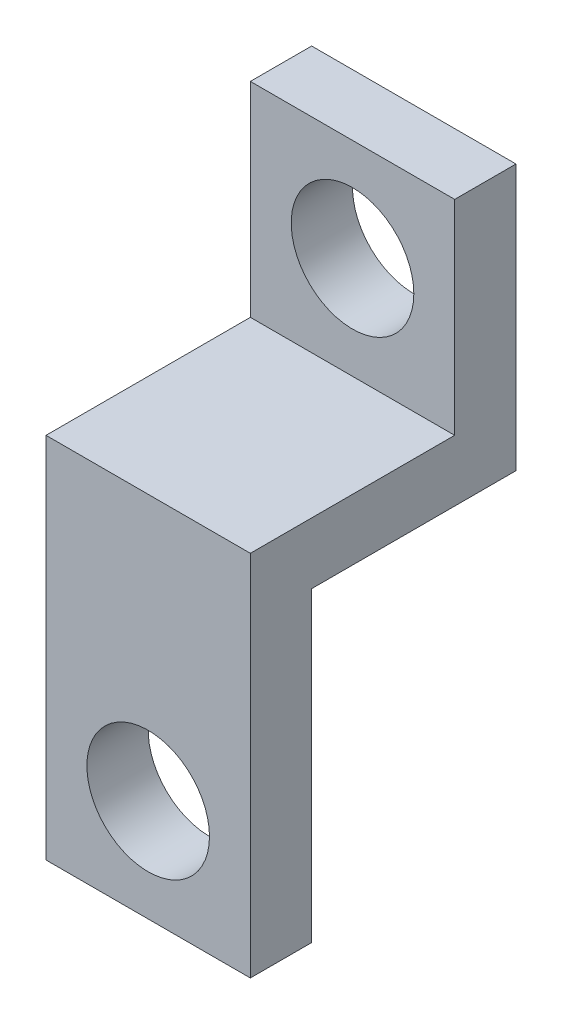
ISO-10303-21;
HEADER;
FILE_DESCRIPTION(('STEP AP214'),'2;1');
FILE_NAME('part.step','',(''),(''),'','','');
FILE_SCHEMA(('AUTOMOTIVE_DESIGN { 1 0 10303 214 1 1 1 1 }'));
ENDSEC;
DATA;
#1=APPLICATION_CONTEXT('core data for automotive mechanical design processes');
#2=APPLICATION_PROTOCOL_DEFINITION('international standard','automotive_design',2000,#1);
#3=PRODUCT_CONTEXT('',#1,'mechanical');
#4=PRODUCT('Part','Part','',(#3));
#5=PRODUCT_RELATED_PRODUCT_CATEGORY('part','',(#4));
#6=PRODUCT_DEFINITION_FORMATION('','',#4);
#7=PRODUCT_DEFINITION_CONTEXT('part definition',#1,'design');
#8=PRODUCT_DEFINITION('design','',#6,#7);
#9=PRODUCT_DEFINITION_SHAPE('','',#8);
#10=(LENGTH_UNIT() NAMED_UNIT(*) SI_UNIT(.MILLI.,.METRE.));
#11=(NAMED_UNIT(*) PLANE_ANGLE_UNIT() SI_UNIT($,.RADIAN.));
#12=(NAMED_UNIT(*) SI_UNIT($,.STERADIAN.) SOLID_ANGLE_UNIT());
#13=UNCERTAINTY_MEASURE_WITH_UNIT(LENGTH_MEASURE(1.E-05),#10,'distance_accuracy_value','');
#14=(GEOMETRIC_REPRESENTATION_CONTEXT(3) GLOBAL_UNCERTAINTY_ASSIGNED_CONTEXT((#13)) GLOBAL_UNIT_ASSIGNED_CONTEXT((#10,
#11,#12)) REPRESENTATION_CONTEXT('',''));
#15=CARTESIAN_POINT('',(0.,0.,0.));
#16=DIRECTION('',(0.,0.,1.));
#17=DIRECTION('',(1.,0.,0.));
#18=AXIS2_PLACEMENT_3D('',#15,#16,#17);
#19=CARTESIAN_POINT('',(10.,0.,3.));
#20=DIRECTION('',(1.,0.,0.));
#21=DIRECTION('',(0.,1.,0.));
#22=AXIS2_PLACEMENT_3D('',#19,#20,#21);
#23=PLANE('',#22);
#24=DIRECTION('',(0.,-1.,0.));
#25=VECTOR('',#24,1.);
#26=CARTESIAN_POINT('',(10.,0.,0.));
#27=LINE('',#26,#25);
#28=CARTESIAN_POINT('',(10.,0.,0.));
#29=VERTEX_POINT('',#28);
#30=CARTESIAN_POINT('',(10.,-15.,0.));
#31=VERTEX_POINT('',#30);
#32=EDGE_CURVE('E181',#29,#31,#27,.T.);
#33=ORIENTED_EDGE('',*,*,#32,.F.);
#34=DIRECTION('',(0.,0.,1.));
#35=VECTOR('',#34,1.);
#36=CARTESIAN_POINT('',(10.,0.,-10.));
#37=LINE('',#36,#35);
#38=CARTESIAN_POINT('',(10.,0.,-10.));
#39=VERTEX_POINT('',#38);
#40=EDGE_CURVE('E74',#39,#29,#37,.T.);
#41=ORIENTED_EDGE('',*,*,#40,.F.);
#42=DIRECTION('',(0.,1.,0.));
#43=VECTOR('',#42,1.);
#44=CARTESIAN_POINT('',(10.,0.,-10.));
#45=LINE('',#44,#43);
#46=CARTESIAN_POINT('',(10.,13.,-10.));
#47=VERTEX_POINT('',#46);
#48=EDGE_CURVE('E154',#39,#47,#45,.T.);
#49=ORIENTED_EDGE('',*,*,#48,.T.);
#50=DIRECTION('',(0.,0.,-1.));
#51=VECTOR('',#50,1.);
#52=CARTESIAN_POINT('',(10.,13.,-7.));
#53=LINE('',#52,#51);
#54=CARTESIAN_POINT('',(10.,13.,-7.));
#55=VERTEX_POINT('',#54);
#56=EDGE_CURVE('E128',#55,#47,#53,.T.);
#57=ORIENTED_EDGE('',*,*,#56,.F.);
#58=DIRECTION('',(0.,1.,0.));
#59=VECTOR('',#58,1.);
#60=CARTESIAN_POINT('',(10.,0.,-7.));
#61=LINE('',#60,#59);
#62=CARTESIAN_POINT('',(10.,3.,-7.));
#63=VERTEX_POINT('',#62);
#64=EDGE_CURVE('E136',#63,#55,#61,.T.);
#65=ORIENTED_EDGE('',*,*,#64,.F.);
#66=DIRECTION('',(0.,0.,-1.));
#67=VECTOR('',#66,1.);
#68=CARTESIAN_POINT('',(10.,3.,3.));
#69=LINE('',#68,#67);
#70=CARTESIAN_POINT('',(10.,3.,3.));
#71=VERTEX_POINT('',#70);
#72=EDGE_CURVE('E12',#71,#63,#69,.T.);
#73=ORIENTED_EDGE('',*,*,#72,.F.);
#74=DIRECTION('',(0.,-1.,0.));
#75=VECTOR('',#74,1.);
#76=CARTESIAN_POINT('',(10.,0.,3.));
#77=LINE('',#76,#75);
#78=CARTESIAN_POINT('',(10.,-15.,3.));
#79=VERTEX_POINT('',#78);
#80=EDGE_CURVE('E166',#71,#79,#77,.T.);
#81=ORIENTED_EDGE('',*,*,#80,.T.);
#82=DIRECTION('',(0.,0.,-1.));
#83=VECTOR('',#82,1.);
#84=CARTESIAN_POINT('',(10.,-15.,3.));
#85=LINE('',#84,#83);
#86=EDGE_CURVE('E178',#79,#31,#85,.T.);
#87=ORIENTED_EDGE('',*,*,#86,.T.);
#88=EDGE_LOOP('',(#33,#41,#49,#57,#65,#73,#81,#87));
#89=FACE_BOUND('',#88,.T.);
#90=ADVANCED_FACE('F52',(#89),#23,.T.);
#91=CARTESIAN_POINT('',(0.,3.,3.));
#92=DIRECTION('',(0.,1.,0.));
#93=DIRECTION('',(0.,0.,1.));
#94=AXIS2_PLACEMENT_3D('',#91,#92,#93);
#95=PLANE('',#94);
#96=DIRECTION('',(1.,0.,0.));
#97=VECTOR('',#96,1.);
#98=CARTESIAN_POINT('',(0.,3.,-7.));
#99=LINE('',#98,#97);
#100=CARTESIAN_POINT('',(0.,3.,-7.));
#101=VERTEX_POINT('',#100);
#102=EDGE_CURVE('E66',#101,#63,#99,.T.);
#103=ORIENTED_EDGE('',*,*,#102,.F.);
#104=DIRECTION('',(0.,0.,-1.));
#105=VECTOR('',#104,1.);
#106=CARTESIAN_POINT('',(0.,3.,3.));
#107=LINE('',#106,#105);
#108=CARTESIAN_POINT('',(0.,3.,3.));
#109=VERTEX_POINT('',#108);
#110=EDGE_CURVE('E60',#109,#101,#107,.T.);
#111=ORIENTED_EDGE('',*,*,#110,.F.);
#112=DIRECTION('',(1.,0.,0.));
#113=VECTOR('',#112,1.);
#114=CARTESIAN_POINT('',(0.,3.,3.));
#115=LINE('',#114,#113);
#116=EDGE_CURVE('E170',#109,#71,#115,.T.);
#117=ORIENTED_EDGE('',*,*,#116,.T.);
#118=ORIENTED_EDGE('',*,*,#72,.T.);
#119=EDGE_LOOP('',(#103,#111,#117,#118));
#120=FACE_BOUND('',#119,.T.);
#121=ADVANCED_FACE('F205',(#120),#95,.T.);
#122=CARTESIAN_POINT('',(0.,0.,3.));
#123=DIRECTION('',(1.,0.,0.));
#124=DIRECTION('',(0.,1.,0.));
#125=AXIS2_PLACEMENT_3D('',#122,#123,#124);
#126=PLANE('',#125);
#127=ORIENTED_EDGE('',*,*,#110,.T.);
#128=DIRECTION('',(0.,1.,0.));
#129=VECTOR('',#128,1.);
#130=CARTESIAN_POINT('',(0.,0.,-7.));
#131=LINE('',#130,#129);
#132=CARTESIAN_POINT('',(0.,13.,-7.));
#133=VERTEX_POINT('',#132);
#134=EDGE_CURVE('E134',#101,#133,#131,.T.);
#135=ORIENTED_EDGE('',*,*,#134,.T.);
#136=DIRECTION('',(0.,0.,-1.));
#137=VECTOR('',#136,1.);
#138=CARTESIAN_POINT('',(0.,13.,-7.));
#139=LINE('',#138,#137);
#140=CARTESIAN_POINT('',(0.,13.,-10.));
#141=VERTEX_POINT('',#140);
#142=EDGE_CURVE('E118',#133,#141,#139,.T.);
#143=ORIENTED_EDGE('',*,*,#142,.T.);
#144=DIRECTION('',(0.,1.,0.));
#145=VECTOR('',#144,1.);
#146=CARTESIAN_POINT('',(0.,0.,-10.));
#147=LINE('',#146,#145);
#148=CARTESIAN_POINT('',(0.,0.,-10.));
#149=VERTEX_POINT('',#148);
#150=EDGE_CURVE('E156',#149,#141,#147,.T.);
#151=ORIENTED_EDGE('',*,*,#150,.F.);
#152=DIRECTION('',(0.,0.,1.));
#153=VECTOR('',#152,1.);
#154=CARTESIAN_POINT('',(0.,0.,-10.));
#155=LINE('',#154,#153);
#156=CARTESIAN_POINT('',(0.,0.,0.));
#157=VERTEX_POINT('',#156);
#158=EDGE_CURVE('E159',#149,#157,#155,.T.);
#159=ORIENTED_EDGE('',*,*,#158,.T.);
#160=DIRECTION('',(0.,-1.,0.));
#161=VECTOR('',#160,1.);
#162=CARTESIAN_POINT('',(0.,0.,0.));
#163=LINE('',#162,#161);
#164=CARTESIAN_POINT('',(0.,-15.,0.));
#165=VERTEX_POINT('',#164);
#166=EDGE_CURVE('E183',#157,#165,#163,.T.);
#167=ORIENTED_EDGE('',*,*,#166,.T.);
#168=DIRECTION('',(0.,0.,-1.));
#169=VECTOR('',#168,1.);
#170=CARTESIAN_POINT('',(0.,-15.,3.));
#171=LINE('',#170,#169);
#172=CARTESIAN_POINT('',(0.,-15.,3.));
#173=VERTEX_POINT('',#172);
#174=EDGE_CURVE('E189',#173,#165,#171,.T.);
#175=ORIENTED_EDGE('',*,*,#174,.F.);
#176=DIRECTION('',(0.,-1.,0.));
#177=VECTOR('',#176,1.);
#178=CARTESIAN_POINT('',(0.,0.,3.));
#179=LINE('',#178,#177);
#180=EDGE_CURVE('E173',#109,#173,#179,.T.);
#181=ORIENTED_EDGE('',*,*,#180,.F.);
#182=EDGE_LOOP('',(#127,#135,#143,#151,#159,#167,#175,#181));
#183=FACE_BOUND('',#182,.T.);
#184=ADVANCED_FACE('F139',(#183),#126,.F.);
#185=CARTESIAN_POINT('',(5.,-10.,3.));
#186=DIRECTION('',(0.,0.,-1.));
#187=DIRECTION('',(-1.,0.,0.));
#188=AXIS2_PLACEMENT_3D('',#185,#186,#187);
#189=CYLINDRICAL_SURFACE('',#188,3.);
#190=CARTESIAN_POINT('',(5.,-10.,3.));
#191=DIRECTION('',(0.,0.,1.));
#192=DIRECTION('',(1.,0.,0.));
#193=AXIS2_PLACEMENT_3D('',#190,#191,#192);
#194=CIRCLE('',#193,3.);
#195=CARTESIAN_POINT('',(8.,-10.,3.));
#196=VERTEX_POINT('',#195);
#197=EDGE_CURVE('E163',#196,#196,#194,.T.);
#198=ORIENTED_EDGE('',*,*,#197,.T.);
#199=EDGE_LOOP('',(#198));
#200=FACE_BOUND('',#199,.T.);
#201=CARTESIAN_POINT('',(5.,-10.,0.));
#202=DIRECTION('',(0.,0.,1.));
#203=DIRECTION('',(1.,0.,0.));
#204=AXIS2_PLACEMENT_3D('',#201,#202,#203);
#205=CIRCLE('',#204,3.);
#206=CARTESIAN_POINT('',(8.,-10.,0.));
#207=VERTEX_POINT('',#206);
#208=EDGE_CURVE('E161',#207,#207,#205,.T.);
#209=ORIENTED_EDGE('',*,*,#208,.F.);
#210=EDGE_LOOP('',(#209));
#211=FACE_BOUND('',#210,.T.);
#212=ADVANCED_FACE('F54',(#200,#211),#189,.F.);
#213=CARTESIAN_POINT('',(0.,-15.,3.));
#214=DIRECTION('',(0.,1.,0.));
#215=DIRECTION('',(0.,0.,1.));
#216=AXIS2_PLACEMENT_3D('',#213,#214,#215);
#217=PLANE('',#216);
#218=DIRECTION('',(1.,0.,0.));
#219=VECTOR('',#218,1.);
#220=CARTESIAN_POINT('',(0.,-15.,0.));
#221=LINE('',#220,#219);
#222=EDGE_CURVE('E167',#165,#31,#221,.T.);
#223=ORIENTED_EDGE('',*,*,#222,.T.);
#224=ORIENTED_EDGE('',*,*,#86,.F.);
#225=DIRECTION('',(1.,0.,0.));
#226=VECTOR('',#225,1.);
#227=CARTESIAN_POINT('',(0.,-15.,3.));
#228=LINE('',#227,#226);
#229=EDGE_CURVE('E176',#173,#79,#228,.T.);
#230=ORIENTED_EDGE('',*,*,#229,.F.);
#231=ORIENTED_EDGE('',*,*,#174,.T.);
#232=EDGE_LOOP('',(#223,#224,#230,#231));
#233=FACE_BOUND('',#232,.T.);
#234=ADVANCED_FACE('F193',(#233),#217,.F.);
#235=CARTESIAN_POINT('',(0.,0.,3.));
#236=DIRECTION('',(0.,0.,1.));
#237=DIRECTION('',(1.,0.,0.));
#238=AXIS2_PLACEMENT_3D('',#235,#236,#237);
#239=PLANE('',#238);
#240=ORIENTED_EDGE('',*,*,#197,.F.);
#241=EDGE_LOOP('',(#240));
#242=FACE_BOUND('',#241,.T.);
#243=ORIENTED_EDGE('',*,*,#80,.F.);
#244=ORIENTED_EDGE('',*,*,#116,.F.);
#245=ORIENTED_EDGE('',*,*,#180,.T.);
#246=ORIENTED_EDGE('',*,*,#229,.T.);
#247=EDGE_LOOP('',(#243,#244,#245,#246));
#248=FACE_BOUND('',#247,.T.);
#249=ADVANCED_FACE('F204',(#242,#248),#239,.T.);
#250=CARTESIAN_POINT('',(0.,0.,0.));
#251=DIRECTION('',(0.,0.,1.));
#252=DIRECTION('',(1.,0.,0.));
#253=AXIS2_PLACEMENT_3D('',#250,#251,#252);
#254=PLANE('',#253);
#255=ORIENTED_EDGE('',*,*,#208,.T.);
#256=EDGE_LOOP('',(#255));
#257=FACE_BOUND('',#256,.T.);
#258=ORIENTED_EDGE('',*,*,#166,.F.);
#259=DIRECTION('',(1.,0.,0.));
#260=VECTOR('',#259,1.);
#261=CARTESIAN_POINT('',(0.,0.,0.));
#262=LINE('',#261,#260);
#263=EDGE_CURVE('E150',#157,#29,#262,.T.);
#264=ORIENTED_EDGE('',*,*,#263,.T.);
#265=ORIENTED_EDGE('',*,*,#32,.T.);
#266=ORIENTED_EDGE('',*,*,#222,.F.);
#267=EDGE_LOOP('',(#258,#264,#265,#266));
#268=FACE_BOUND('',#267,.T.);
#269=ADVANCED_FACE('F199',(#257,#268),#254,.F.);
#270=CARTESIAN_POINT('',(0.,0.,-10.));
#271=DIRECTION('',(0.,-1.,0.));
#272=DIRECTION('',(0.,0.,-1.));
#273=AXIS2_PLACEMENT_3D('',#270,#271,#272);
#274=PLANE('',#273);
#275=ORIENTED_EDGE('',*,*,#263,.F.);
#276=ORIENTED_EDGE('',*,*,#158,.F.);
#277=DIRECTION('',(1.,0.,0.));
#278=VECTOR('',#277,1.);
#279=CARTESIAN_POINT('',(0.,0.,-10.));
#280=LINE('',#279,#278);
#281=EDGE_CURVE('E152',#149,#39,#280,.T.);
#282=ORIENTED_EDGE('',*,*,#281,.T.);
#283=ORIENTED_EDGE('',*,*,#40,.T.);
#284=EDGE_LOOP('',(#275,#276,#282,#283));
#285=FACE_BOUND('',#284,.T.);
#286=ADVANCED_FACE('F211',(#285),#274,.T.);
#287=CARTESIAN_POINT('',(0.,0.,-10.));
#288=DIRECTION('',(0.,0.,1.));
#289=DIRECTION('',(1.,0.,0.));
#290=AXIS2_PLACEMENT_3D('',#287,#288,#289);
#291=PLANE('',#290);
#292=ORIENTED_EDGE('',*,*,#281,.F.);
#293=ORIENTED_EDGE('',*,*,#150,.T.);
#294=DIRECTION('',(1.,0.,0.));
#295=VECTOR('',#294,1.);
#296=CARTESIAN_POINT('',(0.,13.,-10.));
#297=LINE('',#296,#295);
#298=EDGE_CURVE('E124',#141,#47,#297,.T.);
#299=ORIENTED_EDGE('',*,*,#298,.T.);
#300=ORIENTED_EDGE('',*,*,#48,.F.);
#301=EDGE_LOOP('',(#292,#293,#299,#300));
#302=FACE_BOUND('',#301,.T.);
#303=CARTESIAN_POINT('',(5.,8.,-10.));
#304=DIRECTION('',(0.,0.,1.));
#305=DIRECTION('',(1.,0.,0.));
#306=AXIS2_PLACEMENT_3D('',#303,#304,#305);
#307=CIRCLE('',#306,3.);
#308=CARTESIAN_POINT('',(8.,8.,-10.));
#309=VERTEX_POINT('',#308);
#310=EDGE_CURVE('E145',#309,#309,#307,.T.);
#311=ORIENTED_EDGE('',*,*,#310,.T.);
#312=EDGE_LOOP('',(#311));
#313=FACE_BOUND('',#312,.T.);
#314=ADVANCED_FACE('F209',(#302,#313),#291,.F.);
#315=CARTESIAN_POINT('',(0.,0.,-7.));
#316=DIRECTION('',(0.,0.,-1.));
#317=DIRECTION('',(-1.,0.,0.));
#318=AXIS2_PLACEMENT_3D('',#315,#316,#317);
#319=PLANE('',#318);
#320=ORIENTED_EDGE('',*,*,#134,.F.);
#321=ORIENTED_EDGE('',*,*,#102,.T.);
#322=ORIENTED_EDGE('',*,*,#64,.T.);
#323=DIRECTION('',(1.,0.,0.));
#324=VECTOR('',#323,1.);
#325=CARTESIAN_POINT('',(0.,13.,-7.));
#326=LINE('',#325,#324);
#327=EDGE_CURVE('E122',#133,#55,#326,.T.);
#328=ORIENTED_EDGE('',*,*,#327,.F.);
#329=EDGE_LOOP('',(#320,#321,#322,#328));
#330=FACE_BOUND('',#329,.T.);
#331=CARTESIAN_POINT('',(5.,8.,-7.));
#332=DIRECTION('',(0.,0.,1.));
#333=DIRECTION('',(1.,0.,0.));
#334=AXIS2_PLACEMENT_3D('',#331,#332,#333);
#335=CIRCLE('',#334,3.);
#336=CARTESIAN_POINT('',(8.,8.,-7.));
#337=VERTEX_POINT('',#336);
#338=EDGE_CURVE('E142',#337,#337,#335,.T.);
#339=ORIENTED_EDGE('',*,*,#338,.F.);
#340=EDGE_LOOP('',(#339));
#341=FACE_BOUND('',#340,.T.);
#342=ADVANCED_FACE('F132',(#330,#341),#319,.F.);
#343=CARTESIAN_POINT('',(0.,13.,-7.));
#344=DIRECTION('',(0.,1.,0.));
#345=DIRECTION('',(0.,0.,1.));
#346=AXIS2_PLACEMENT_3D('',#343,#344,#345);
#347=PLANE('',#346);
#348=ORIENTED_EDGE('',*,*,#298,.F.);
#349=ORIENTED_EDGE('',*,*,#142,.F.);
#350=ORIENTED_EDGE('',*,*,#327,.T.);
#351=ORIENTED_EDGE('',*,*,#56,.T.);
#352=EDGE_LOOP('',(#348,#349,#350,#351));
#353=FACE_BOUND('',#352,.T.);
#354=ADVANCED_FACE('F120',(#353),#347,.T.);
#355=CARTESIAN_POINT('',(5.,8.,-7.));
#356=DIRECTION('',(0.,0.,-1.));
#357=DIRECTION('',(-1.,0.,0.));
#358=AXIS2_PLACEMENT_3D('',#355,#356,#357);
#359=CYLINDRICAL_SURFACE('',#358,3.);
#360=ORIENTED_EDGE('',*,*,#338,.T.);
#361=EDGE_LOOP('',(#360));
#362=FACE_BOUND('',#361,.T.);
#363=ORIENTED_EDGE('',*,*,#310,.F.);
#364=EDGE_LOOP('',(#363));
#365=FACE_BOUND('',#364,.T.);
#366=ADVANCED_FACE('F306',(#362,#365),#359,.F.);
#367=CLOSED_SHELL('',(#90,#121,#184,#212,#234,#249,#269,#286,#314,#342,#354,#366));
#368=MANIFOLD_SOLID_BREP('B2',#367);
#369=ADVANCED_BREP_SHAPE_REPRESENTATION('',(#18,#368),#14);
#370=SHAPE_DEFINITION_REPRESENTATION(#9,#369);
ENDSEC;
END-ISO-10303-21;
